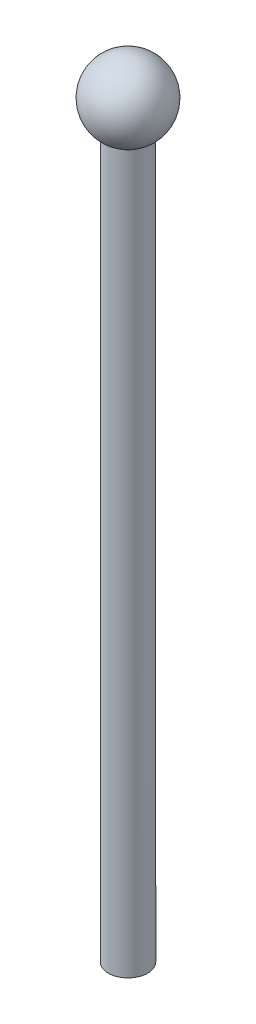
ISO-10303-21;
HEADER;
FILE_DESCRIPTION(('STEP AP214'),'2;1');
FILE_NAME('part.step','',(''),(''),'','','');
FILE_SCHEMA(('AUTOMOTIVE_DESIGN { 1 0 10303 214 1 1 1 1 }'));
ENDSEC;
DATA;
#1=APPLICATION_CONTEXT('core data for automotive mechanical design processes');
#2=APPLICATION_PROTOCOL_DEFINITION('international standard','automotive_design',2000,#1);
#3=PRODUCT_CONTEXT('',#1,'mechanical');
#4=PRODUCT('Part','Part','',(#3));
#5=PRODUCT_RELATED_PRODUCT_CATEGORY('part','',(#4));
#6=PRODUCT_DEFINITION_FORMATION('','',#4);
#7=PRODUCT_DEFINITION_CONTEXT('part definition',#1,'design');
#8=PRODUCT_DEFINITION('design','',#6,#7);
#9=PRODUCT_DEFINITION_SHAPE('','',#8);
#10=(LENGTH_UNIT() NAMED_UNIT(*) SI_UNIT(.MILLI.,.METRE.));
#11=(NAMED_UNIT(*) PLANE_ANGLE_UNIT() SI_UNIT($,.RADIAN.));
#12=(NAMED_UNIT(*) SI_UNIT($,.STERADIAN.) SOLID_ANGLE_UNIT());
#13=UNCERTAINTY_MEASURE_WITH_UNIT(LENGTH_MEASURE(1.E-05),#10,'distance_accuracy_value','');
#14=(GEOMETRIC_REPRESENTATION_CONTEXT(3) GLOBAL_UNCERTAINTY_ASSIGNED_CONTEXT((#13)) GLOBAL_UNIT_ASSIGNED_CONTEXT((#10,
#11,#12)) REPRESENTATION_CONTEXT('',''));
#15=CARTESIAN_POINT('',(0.,0.,0.));
#16=DIRECTION('',(0.,0.,1.));
#17=DIRECTION('',(1.,0.,0.));
#18=AXIS2_PLACEMENT_3D('',#15,#16,#17);
#19=CARTESIAN_POINT('',(0.,0.,0.));
#20=DIRECTION('',(0.,1.,0.));
#21=DIRECTION('',(1.,0.,0.));
#22=AXIS2_PLACEMENT_3D('',#19,#20,#21);
#23=SPHERICAL_SURFACE('',#22,3.75);
#24=CARTESIAN_POINT('',(0.,-3.17214438511238,0.));
#25=DIRECTION('',(0.,1.,0.));
#26=DIRECTION('',(-1.,0.,0.));
#27=AXIS2_PLACEMENT_3D('',#24,#25,#26);
#28=CIRCLE('',#27,2.);
#29=CARTESIAN_POINT('',(-2.,-3.17214438511238,0.));
#30=VERTEX_POINT('',#29);
#31=EDGE_CURVE('E10',#30,#30,#28,.T.);
#32=ORIENTED_EDGE('',*,*,#31,.T.);
#33=EDGE_LOOP('',(#32));
#34=FACE_BOUND('',#33,.T.);
#35=ADVANCED_FACE('F39',(#34),#23,.T.);
#36=CARTESIAN_POINT('',(0.,3.75,0.));
#37=DIRECTION('',(0.,1.,0.));
#38=DIRECTION('',(-1.,0.,0.));
#39=AXIS2_PLACEMENT_3D('',#36,#37,#38);
#40=CYLINDRICAL_SURFACE('',#39,2.);
#41=ORIENTED_EDGE('',*,*,#31,.F.);
#42=EDGE_LOOP('',(#41));
#43=FACE_BOUND('',#42,.T.);
#44=CARTESIAN_POINT('',(0.,-76.25,0.));
#45=DIRECTION('',(0.,1.,0.));
#46=DIRECTION('',(-1.,0.,0.));
#47=AXIS2_PLACEMENT_3D('',#44,#45,#46);
#48=CIRCLE('',#47,2.);
#49=CARTESIAN_POINT('',(-1.99999999999999,-76.25,0.));
#50=VERTEX_POINT('',#49);
#51=EDGE_CURVE('E45',#50,#50,#48,.T.);
#52=ORIENTED_EDGE('',*,*,#51,.T.);
#53=EDGE_LOOP('',(#52));
#54=FACE_BOUND('',#53,.T.);
#55=ADVANCED_FACE('F51',(#43,#54),#40,.T.);
#56=CARTESIAN_POINT('',(0.,-76.25,0.));
#57=DIRECTION('',(0.,1.,0.));
#58=DIRECTION('',(-1.,0.,0.));
#59=AXIS2_PLACEMENT_3D('',#56,#57,#58);
#60=PLANE('',#59);
#61=ORIENTED_EDGE('',*,*,#51,.F.);
#62=EDGE_LOOP('',(#61));
#63=FACE_BOUND('',#62,.T.);
#64=ADVANCED_FACE('F53',(#63),#60,.F.);
#65=CLOSED_SHELL('',(#35,#55,#64));
#66=MANIFOLD_SOLID_BREP('B2',#65);
#67=ADVANCED_BREP_SHAPE_REPRESENTATION('',(#18,#66),#14);
#68=SHAPE_DEFINITION_REPRESENTATION(#9,#67);
ENDSEC;
END-ISO-10303-21;
